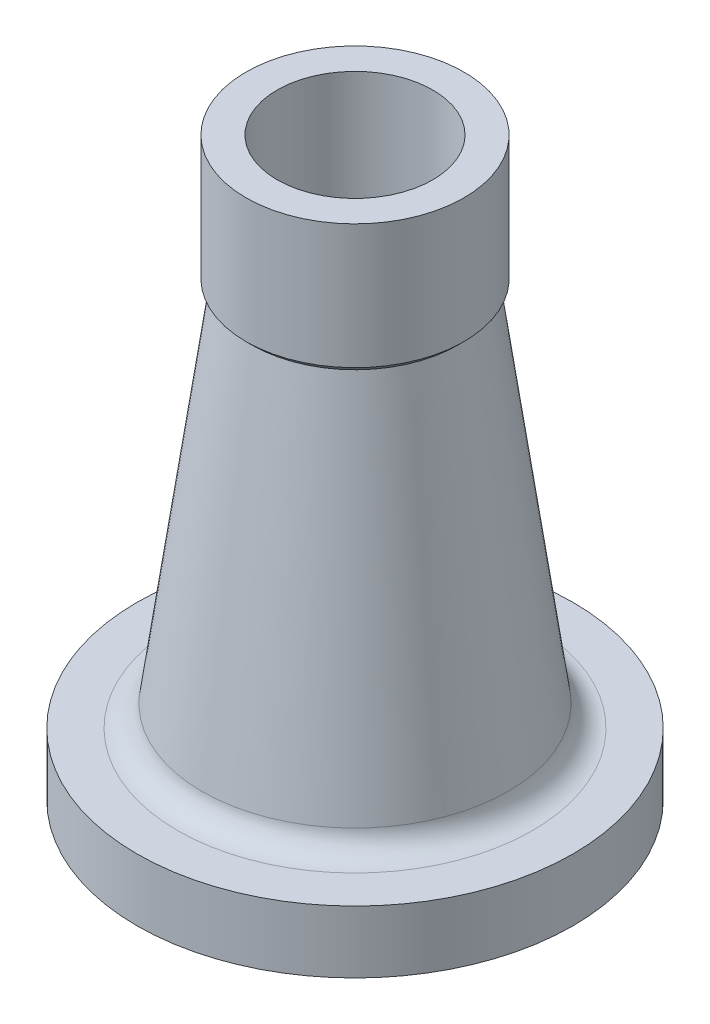
ISO-10303-21;
HEADER;
FILE_DESCRIPTION(('STEP AP214'),'2;1');
FILE_NAME('part.step','',(''),(''),'','','');
FILE_SCHEMA(('AUTOMOTIVE_DESIGN { 1 0 10303 214 1 1 1 1 }'));
ENDSEC;
DATA;
#1=APPLICATION_CONTEXT('core data for automotive mechanical design processes');
#2=APPLICATION_PROTOCOL_DEFINITION('international standard','automotive_design',2000,#1);
#3=PRODUCT_CONTEXT('',#1,'mechanical');
#4=PRODUCT('Part','Part','',(#3));
#5=PRODUCT_RELATED_PRODUCT_CATEGORY('part','',(#4));
#6=PRODUCT_DEFINITION_FORMATION('','',#4);
#7=PRODUCT_DEFINITION_CONTEXT('part definition',#1,'design');
#8=PRODUCT_DEFINITION('design','',#6,#7);
#9=PRODUCT_DEFINITION_SHAPE('','',#8);
#10=(LENGTH_UNIT() NAMED_UNIT(*) SI_UNIT(.MILLI.,.METRE.));
#11=(NAMED_UNIT(*) PLANE_ANGLE_UNIT() SI_UNIT($,.RADIAN.));
#12=(NAMED_UNIT(*) SI_UNIT($,.STERADIAN.) SOLID_ANGLE_UNIT());
#13=UNCERTAINTY_MEASURE_WITH_UNIT(LENGTH_MEASURE(1.E-05),#10,'distance_accuracy_value','');
#14=(GEOMETRIC_REPRESENTATION_CONTEXT(3) GLOBAL_UNCERTAINTY_ASSIGNED_CONTEXT((#13)) GLOBAL_UNIT_ASSIGNED_CONTEXT((#10,
#11,#12)) REPRESENTATION_CONTEXT('',''));
#15=CARTESIAN_POINT('',(0.,0.,0.));
#16=DIRECTION('',(0.,0.,1.));
#17=DIRECTION('',(1.,0.,0.));
#18=AXIS2_PLACEMENT_3D('',#15,#16,#17);
#19=CARTESIAN_POINT('',(50.,0.,0.));
#20=DIRECTION('',(0.,1.,0.));
#21=DIRECTION('',(0.,0.,1.));
#22=AXIS2_PLACEMENT_3D('',#19,#20,#21);
#23=PLANE('',#22);
#24=CARTESIAN_POINT('',(0.,0.,0.));
#25=DIRECTION('',(0.,1.,0.));
#26=DIRECTION('',(0.,0.,1.));
#27=AXIS2_PLACEMENT_3D('',#24,#25,#26);
#28=CIRCLE('',#27,70.);
#29=CARTESIAN_POINT('',(0.,0.,70.));
#30=VERTEX_POINT('',#29);
#31=EDGE_CURVE('E10',#30,#30,#28,.T.);
#32=ORIENTED_EDGE('',*,*,#31,.F.);
#33=EDGE_LOOP('',(#32));
#34=FACE_BOUND('',#33,.T.);
#35=CARTESIAN_POINT('',(0.,0.,0.));
#36=DIRECTION('',(0.,1.,0.));
#37=DIRECTION('',(0.,0.,1.));
#38=AXIS2_PLACEMENT_3D('',#35,#36,#37);
#39=CIRCLE('',#38,50.);
#40=CARTESIAN_POINT('',(0.,0.,50.));
#41=VERTEX_POINT('',#40);
#42=EDGE_CURVE('E78',#41,#41,#39,.T.);
#43=ORIENTED_EDGE('',*,*,#42,.T.);
#44=EDGE_LOOP('',(#43));
#45=FACE_BOUND('',#44,.T.);
#46=ADVANCED_FACE('F35',(#34,#45),#23,.F.);
#47=CARTESIAN_POINT('',(0.,99.4900221729491,0.));
#48=DIRECTION('',(0.,1.,0.));
#49=DIRECTION('',(0.,0.,1.));
#50=AXIS2_PLACEMENT_3D('',#47,#48,#49);
#51=CYLINDRICAL_SURFACE('',#50,70.);
#52=CARTESIAN_POINT('',(0.,20.,0.));
#53=DIRECTION('',(0.,1.,0.));
#54=DIRECTION('',(0.,0.,1.));
#55=AXIS2_PLACEMENT_3D('',#52,#53,#54);
#56=CIRCLE('',#55,70.);
#57=CARTESIAN_POINT('',(0.,20.,70.));
#58=VERTEX_POINT('',#57);
#59=EDGE_CURVE('E41',#58,#58,#56,.T.);
#60=ORIENTED_EDGE('',*,*,#59,.F.);
#61=EDGE_LOOP('',(#60));
#62=FACE_BOUND('',#61,.T.);
#63=ORIENTED_EDGE('',*,*,#31,.T.);
#64=EDGE_LOOP('',(#63));
#65=FACE_BOUND('',#64,.T.);
#66=ADVANCED_FACE('F145',(#62,#65),#51,.T.);
#67=CARTESIAN_POINT('',(70.,20.,0.));
#68=DIRECTION('',(0.,-1.,0.));
#69=DIRECTION('',(0.,0.,-1.));
#70=AXIS2_PLACEMENT_3D('',#67,#68,#69);
#71=PLANE('',#70);
#72=CARTESIAN_POINT('',(0.,20.,0.));
#73=DIRECTION('',(0.,1.,0.));
#74=DIRECTION('',(0.,0.,1.));
#75=AXIS2_PLACEMENT_3D('',#72,#73,#74);
#76=CIRCLE('',#75,57.);
#77=CARTESIAN_POINT('',(0.,20.,57.));
#78=VERTEX_POINT('',#77);
#79=EDGE_CURVE('E45',#78,#78,#76,.T.);
#80=ORIENTED_EDGE('',*,*,#79,.F.);
#81=EDGE_LOOP('',(#80));
#82=FACE_BOUND('',#81,.T.);
#83=ORIENTED_EDGE('',*,*,#59,.T.);
#84=EDGE_LOOP('',(#83));
#85=FACE_BOUND('',#84,.T.);
#86=ADVANCED_FACE('F140',(#82,#85),#71,.F.);
#87=CARTESIAN_POINT('',(0.,28.,0.));
#88=DIRECTION('',(0.,1.,0.));
#89=DIRECTION('',(0.,0.,1.));
#90=AXIS2_PLACEMENT_3D('',#87,#88,#89);
#91=TOROIDAL_SURFACE('',#90,57.,8.);
#92=CARTESIAN_POINT('',(0.,26.9027352981241,0.));
#93=DIRECTION('',(0.,1.,0.));
#94=DIRECTION('',(0.,0.,1.));
#95=AXIS2_PLACEMENT_3D('',#92,#93,#94);
#96=CIRCLE('',#95,49.0756066368449);
#97=CARTESIAN_POINT('',(0.,26.9027352981241,49.0756066368449));
#98=VERTEX_POINT('',#97);
#99=EDGE_CURVE('E49',#98,#98,#96,.T.);
#100=ORIENTED_EDGE('',*,*,#99,.F.);
#101=EDGE_LOOP('',(#100));
#102=FACE_BOUND('',#101,.T.);
#103=ORIENTED_EDGE('',*,*,#79,.T.);
#104=EDGE_LOOP('',(#103));
#105=FACE_BOUND('',#104,.T.);
#106=ADVANCED_FACE('F134',(#102,#105),#91,.F.);
#107=CARTESIAN_POINT('',(0.,26.9027352981241,0.));
#108=DIRECTION('',(0.,-1.,0.));
#109=DIRECTION('',(0.,0.,-1.));
#110=AXIS2_PLACEMENT_3D('',#107,#108,#109);
#111=CONICAL_SURFACE('',#110,49.0756066368449,0.137591813711866);
#112=CARTESIAN_POINT('',(0.,143.,0.));
#113=DIRECTION('',(0.,1.,0.));
#114=DIRECTION('',(0.,0.,1.));
#115=AXIS2_PLACEMENT_3D('',#112,#113,#114);
#116=CIRCLE('',#115,33.);
#117=CARTESIAN_POINT('',(0.,143.,33.));
#118=VERTEX_POINT('',#117);
#119=EDGE_CURVE('E54',#118,#118,#116,.T.);
#120=ORIENTED_EDGE('',*,*,#119,.F.);
#121=EDGE_LOOP('',(#120));
#122=FACE_BOUND('',#121,.T.);
#123=ORIENTED_EDGE('',*,*,#99,.T.);
#124=EDGE_LOOP('',(#123));
#125=FACE_BOUND('',#124,.T.);
#126=ADVANCED_FACE('F128',(#122,#125),#111,.T.);
#127=CARTESIAN_POINT('',(0.,143.,0.));
#128=DIRECTION('',(0.,1.,0.));
#129=DIRECTION('',(0.,0.,1.));
#130=AXIS2_PLACEMENT_3D('',#127,#128,#129);
#131=CONICAL_SURFACE('',#130,33.,0.78539816339745);
#132=CARTESIAN_POINT('',(0.,145.,0.));
#133=DIRECTION('',(0.,1.,0.));
#134=DIRECTION('',(0.,0.,1.));
#135=AXIS2_PLACEMENT_3D('',#132,#133,#134);
#136=CIRCLE('',#135,35.);
#137=CARTESIAN_POINT('',(0.,145.,35.));
#138=VERTEX_POINT('',#137);
#139=EDGE_CURVE('E57',#138,#138,#136,.T.);
#140=ORIENTED_EDGE('',*,*,#139,.F.);
#141=EDGE_LOOP('',(#140));
#142=FACE_BOUND('',#141,.T.);
#143=ORIENTED_EDGE('',*,*,#119,.T.);
#144=EDGE_LOOP('',(#143));
#145=FACE_BOUND('',#144,.T.);
#146=ADVANCED_FACE('F122',(#142,#145),#131,.T.);
#147=CARTESIAN_POINT('',(0.,99.4900221729491,0.));
#148=DIRECTION('',(0.,1.,0.));
#149=DIRECTION('',(0.,0.,1.));
#150=AXIS2_PLACEMENT_3D('',#147,#148,#149);
#151=CYLINDRICAL_SURFACE('',#150,35.);
#152=CARTESIAN_POINT('',(0.,185.,0.));
#153=DIRECTION('',(0.,1.,0.));
#154=DIRECTION('',(0.,0.,1.));
#155=AXIS2_PLACEMENT_3D('',#152,#153,#154);
#156=CIRCLE('',#155,35.);
#157=CARTESIAN_POINT('',(0.,185.,35.));
#158=VERTEX_POINT('',#157);
#159=EDGE_CURVE('E60',#158,#158,#156,.T.);
#160=ORIENTED_EDGE('',*,*,#159,.F.);
#161=EDGE_LOOP('',(#160));
#162=FACE_BOUND('',#161,.T.);
#163=ORIENTED_EDGE('',*,*,#139,.T.);
#164=EDGE_LOOP('',(#163));
#165=FACE_BOUND('',#164,.T.);
#166=ADVANCED_FACE('F116',(#162,#165),#151,.T.);
#167=CARTESIAN_POINT('',(25.,185.,0.));
#168=DIRECTION('',(0.,-1.,0.));
#169=DIRECTION('',(0.,0.,-1.));
#170=AXIS2_PLACEMENT_3D('',#167,#168,#169);
#171=PLANE('',#170);
#172=CARTESIAN_POINT('',(0.,185.,0.));
#173=DIRECTION('',(0.,1.,0.));
#174=DIRECTION('',(0.,0.,1.));
#175=AXIS2_PLACEMENT_3D('',#172,#173,#174);
#176=CIRCLE('',#175,25.);
#177=CARTESIAN_POINT('',(0.,185.,25.));
#178=VERTEX_POINT('',#177);
#179=EDGE_CURVE('E63',#178,#178,#176,.T.);
#180=ORIENTED_EDGE('',*,*,#179,.F.);
#181=EDGE_LOOP('',(#180));
#182=FACE_BOUND('',#181,.T.);
#183=ORIENTED_EDGE('',*,*,#159,.T.);
#184=EDGE_LOOP('',(#183));
#185=FACE_BOUND('',#184,.T.);
#186=ADVANCED_FACE('F110',(#182,#185),#171,.F.);
#187=CARTESIAN_POINT('',(0.,99.4900221729491,0.));
#188=DIRECTION('',(0.,1.,0.));
#189=DIRECTION('',(0.,0.,1.));
#190=AXIS2_PLACEMENT_3D('',#187,#188,#189);
#191=CYLINDRICAL_SURFACE('',#190,25.);
#192=CARTESIAN_POINT('',(0.,127.867048884037,0.));
#193=DIRECTION('',(0.,1.,0.));
#194=DIRECTION('',(0.,0.,1.));
#195=AXIS2_PLACEMENT_3D('',#192,#193,#194);
#196=CIRCLE('',#195,25.);
#197=CARTESIAN_POINT('',(0.,127.867048884037,25.));
#198=VERTEX_POINT('',#197);
#199=EDGE_CURVE('E66',#198,#198,#196,.T.);
#200=ORIENTED_EDGE('',*,*,#199,.F.);
#201=EDGE_LOOP('',(#200));
#202=FACE_BOUND('',#201,.T.);
#203=ORIENTED_EDGE('',*,*,#179,.T.);
#204=EDGE_LOOP('',(#203));
#205=FACE_BOUND('',#204,.T.);
#206=ADVANCED_FACE('F104',(#202,#205),#191,.F.);
#207=CARTESIAN_POINT('',(0.,127.867048884037,0.));
#208=DIRECTION('',(0.,-1.,0.));
#209=DIRECTION('',(0.,0.,-1.));
#210=AXIS2_PLACEMENT_3D('',#207,#208,#209);
#211=CONICAL_SURFACE('',#210,25.,0.137591813711866);
#212=CARTESIAN_POINT('',(0.,2.99999999999999,0.));
#213=DIRECTION('',(0.,1.,0.));
#214=DIRECTION('',(0.,0.,1.));
#215=AXIS2_PLACEMENT_3D('',#212,#213,#214);
#216=CIRCLE('',#215,42.2899298266674);
#217=CARTESIAN_POINT('',(0.,2.99999999999999,42.2899298266674));
#218=VERTEX_POINT('',#217);
#219=EDGE_CURVE('E69',#218,#218,#216,.T.);
#220=ORIENTED_EDGE('',*,*,#219,.F.);
#221=EDGE_LOOP('',(#220));
#222=FACE_BOUND('',#221,.T.);
#223=ORIENTED_EDGE('',*,*,#199,.T.);
#224=EDGE_LOOP('',(#223));
#225=FACE_BOUND('',#224,.T.);
#226=ADVANCED_FACE('F98',(#222,#225),#211,.F.);
#227=CARTESIAN_POINT('',(48.,2.99999999999999,0.));
#228=DIRECTION('',(0.,1.,0.));
#229=DIRECTION('',(0.,0.,1.));
#230=AXIS2_PLACEMENT_3D('',#227,#228,#229);
#231=PLANE('',#230);
#232=CARTESIAN_POINT('',(0.,3.,0.));
#233=DIRECTION('',(0.,1.,0.));
#234=DIRECTION('',(0.,0.,1.));
#235=AXIS2_PLACEMENT_3D('',#232,#233,#234);
#236=CIRCLE('',#235,48.);
#237=CARTESIAN_POINT('',(0.,3.,48.));
#238=VERTEX_POINT('',#237);
#239=EDGE_CURVE('E72',#238,#238,#236,.T.);
#240=ORIENTED_EDGE('',*,*,#239,.F.);
#241=EDGE_LOOP('',(#240));
#242=FACE_BOUND('',#241,.T.);
#243=ORIENTED_EDGE('',*,*,#219,.T.);
#244=EDGE_LOOP('',(#243));
#245=FACE_BOUND('',#244,.T.);
#246=ADVANCED_FACE('F92',(#242,#245),#231,.F.);
#247=CARTESIAN_POINT('',(0.,0.999999999999997,0.));
#248=DIRECTION('',(0.,1.,0.));
#249=DIRECTION('',(0.,0.,1.));
#250=AXIS2_PLACEMENT_3D('',#247,#248,#249);
#251=TOROIDAL_SURFACE('',#250,48.,2.);
#252=CARTESIAN_POINT('',(0.,1.,0.));
#253=DIRECTION('',(0.,1.,0.));
#254=DIRECTION('',(0.,0.,1.));
#255=AXIS2_PLACEMENT_3D('',#252,#253,#254);
#256=CIRCLE('',#255,50.);
#257=CARTESIAN_POINT('',(0.,1.,50.));
#258=VERTEX_POINT('',#257);
#259=EDGE_CURVE('E75',#258,#258,#256,.T.);
#260=ORIENTED_EDGE('',*,*,#259,.F.);
#261=EDGE_LOOP('',(#260));
#262=FACE_BOUND('',#261,.T.);
#263=ORIENTED_EDGE('',*,*,#239,.T.);
#264=EDGE_LOOP('',(#263));
#265=FACE_BOUND('',#264,.T.);
#266=ADVANCED_FACE('F86',(#262,#265),#251,.F.);
#267=CARTESIAN_POINT('',(0.,99.4900221729491,0.));
#268=DIRECTION('',(0.,1.,0.));
#269=DIRECTION('',(0.,0.,1.));
#270=AXIS2_PLACEMENT_3D('',#267,#268,#269);
#271=CYLINDRICAL_SURFACE('',#270,50.);
#272=ORIENTED_EDGE('',*,*,#42,.F.);
#273=EDGE_LOOP('',(#272));
#274=FACE_BOUND('',#273,.T.);
#275=ORIENTED_EDGE('',*,*,#259,.T.);
#276=EDGE_LOOP('',(#275));
#277=FACE_BOUND('',#276,.T.);
#278=ADVANCED_FACE('F83',(#274,#277),#271,.F.);
#279=CLOSED_SHELL('',(#46,#66,#86,#106,#126,#146,#166,#186,#206,#226,#246,#266,#278));
#280=MANIFOLD_SOLID_BREP('B2',#279);
#281=ADVANCED_BREP_SHAPE_REPRESENTATION('',(#18,#280),#14);
#282=SHAPE_DEFINITION_REPRESENTATION(#9,#281);
ENDSEC;
END-ISO-10303-21;
